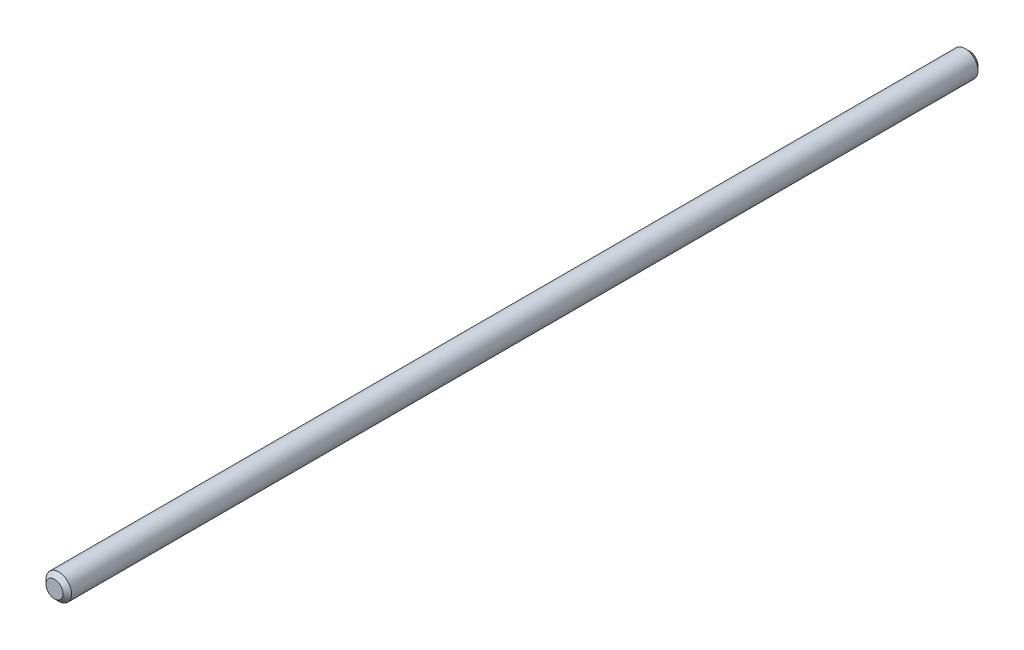
ISO-10303-21;
HEADER;
FILE_DESCRIPTION(('STEP AP214'),'2;1');
FILE_NAME('part.step','',(''),(''),'','','');
FILE_SCHEMA(('AUTOMOTIVE_DESIGN { 1 0 10303 214 1 1 1 1 }'));
ENDSEC;
DATA;
#1=APPLICATION_CONTEXT('core data for automotive mechanical design processes');
#2=APPLICATION_PROTOCOL_DEFINITION('international standard','automotive_design',2000,#1);
#3=PRODUCT_CONTEXT('',#1,'mechanical');
#4=PRODUCT('Part','Part','',(#3));
#5=PRODUCT_RELATED_PRODUCT_CATEGORY('part','',(#4));
#6=PRODUCT_DEFINITION_FORMATION('','',#4);
#7=PRODUCT_DEFINITION_CONTEXT('part definition',#1,'design');
#8=PRODUCT_DEFINITION('design','',#6,#7);
#9=PRODUCT_DEFINITION_SHAPE('','',#8);
#10=(LENGTH_UNIT() NAMED_UNIT(*) SI_UNIT(.MILLI.,.METRE.));
#11=(NAMED_UNIT(*) PLANE_ANGLE_UNIT() SI_UNIT($,.RADIAN.));
#12=(NAMED_UNIT(*) SI_UNIT($,.STERADIAN.) SOLID_ANGLE_UNIT());
#13=UNCERTAINTY_MEASURE_WITH_UNIT(LENGTH_MEASURE(1.E-05),#10,'distance_accuracy_value','');
#14=(GEOMETRIC_REPRESENTATION_CONTEXT(3) GLOBAL_UNCERTAINTY_ASSIGNED_CONTEXT((#13)) GLOBAL_UNIT_ASSIGNED_CONTEXT((#10,
#11,#12)) REPRESENTATION_CONTEXT('',''));
#15=CARTESIAN_POINT('',(0.,0.,0.));
#16=DIRECTION('',(0.,0.,1.));
#17=DIRECTION('',(1.,0.,0.));
#18=AXIS2_PLACEMENT_3D('',#15,#16,#17);
#19=CARTESIAN_POINT('',(0.,0.,107.5));
#20=DIRECTION('',(0.,0.,-1.));
#21=DIRECTION('',(-1.,0.,0.));
#22=AXIS2_PLACEMENT_3D('',#19,#20,#21);
#23=CYLINDRICAL_SURFACE('',#22,3.);
#24=CARTESIAN_POINT('',(0.,0.,-106.5));
#25=DIRECTION('',(0.,0.,1.));
#26=DIRECTION('',(1.,0.,0.));
#27=AXIS2_PLACEMENT_3D('',#24,#25,#26);
#28=CIRCLE('',#27,3.);
#29=CARTESIAN_POINT('',(3.,0.,-106.5));
#30=VERTEX_POINT('',#29);
#31=EDGE_CURVE('E41',#30,#30,#28,.T.);
#32=ORIENTED_EDGE('',*,*,#31,.T.);
#33=EDGE_LOOP('',(#32));
#34=FACE_BOUND('',#33,.T.);
#35=CARTESIAN_POINT('',(0.,0.,106.5));
#36=DIRECTION('',(0.,0.,1.));
#37=DIRECTION('',(1.,0.,0.));
#38=AXIS2_PLACEMENT_3D('',#35,#36,#37);
#39=CIRCLE('',#38,3.);
#40=CARTESIAN_POINT('',(3.,0.,106.5));
#41=VERTEX_POINT('',#40);
#42=EDGE_CURVE('E45',#41,#41,#39,.F.);
#43=ORIENTED_EDGE('',*,*,#42,.T.);
#44=EDGE_LOOP('',(#43));
#45=FACE_BOUND('',#44,.T.);
#46=ADVANCED_FACE('F30',(#34,#45),#23,.T.);
#47=CARTESIAN_POINT('',(0.,0.,107.5));
#48=DIRECTION('',(0.,0.,1.));
#49=DIRECTION('',(1.,0.,0.));
#50=AXIS2_PLACEMENT_3D('',#47,#48,#49);
#51=PLANE('',#50);
#52=CARTESIAN_POINT('',(0.,0.,107.5));
#53=DIRECTION('',(0.,0.,1.));
#54=DIRECTION('',(1.,0.,0.));
#55=AXIS2_PLACEMENT_3D('',#52,#53,#54);
#56=CIRCLE('',#55,2.00000000000003);
#57=CARTESIAN_POINT('',(2.00000000000003,0.,107.5));
#58=VERTEX_POINT('',#57);
#59=EDGE_CURVE('E10',#58,#58,#56,.T.);
#60=ORIENTED_EDGE('',*,*,#59,.T.);
#61=EDGE_LOOP('',(#60));
#62=FACE_BOUND('',#61,.T.);
#63=ADVANCED_FACE('F61',(#62),#51,.T.);
#64=CARTESIAN_POINT('',(0.,0.,-107.5));
#65=DIRECTION('',(0.,0.,1.));
#66=DIRECTION('',(1.,0.,0.));
#67=AXIS2_PLACEMENT_3D('',#64,#65,#66);
#68=PLANE('',#67);
#69=CARTESIAN_POINT('',(0.,0.,-107.5));
#70=DIRECTION('',(0.,0.,1.));
#71=DIRECTION('',(1.,0.,0.));
#72=AXIS2_PLACEMENT_3D('',#69,#70,#71);
#73=CIRCLE('',#72,2.00000000000003);
#74=CARTESIAN_POINT('',(2.00000000000003,0.,-107.5));
#75=VERTEX_POINT('',#74);
#76=EDGE_CURVE('E37',#75,#75,#73,.F.);
#77=ORIENTED_EDGE('',*,*,#76,.T.);
#78=EDGE_LOOP('',(#77));
#79=FACE_BOUND('',#78,.T.);
#80=ADVANCED_FACE('F58',(#79),#68,.F.);
#81=CARTESIAN_POINT('',(0.,0.,-106.5));
#82=DIRECTION('',(0.,0.,1.));
#83=DIRECTION('',(1.,0.,0.));
#84=AXIS2_PLACEMENT_3D('',#81,#82,#83);
#85=CONICAL_SURFACE('',#84,3.,0.785398163397447);
#86=ORIENTED_EDGE('',*,*,#76,.F.);
#87=EDGE_LOOP('',(#86));
#88=FACE_BOUND('',#87,.T.);
#89=ORIENTED_EDGE('',*,*,#31,.F.);
#90=EDGE_LOOP('',(#89));
#91=FACE_BOUND('',#90,.T.);
#92=ADVANCED_FACE('F54',(#88,#91),#85,.T.);
#93=CARTESIAN_POINT('',(0.,0.,107.5));
#94=DIRECTION('',(0.,0.,-1.));
#95=DIRECTION('',(-1.,0.,0.));
#96=AXIS2_PLACEMENT_3D('',#93,#94,#95);
#97=CONICAL_SURFACE('',#96,2.00000000000003,0.78539816339744);
#98=ORIENTED_EDGE('',*,*,#42,.F.);
#99=EDGE_LOOP('',(#98));
#100=FACE_BOUND('',#99,.T.);
#101=ORIENTED_EDGE('',*,*,#59,.F.);
#102=EDGE_LOOP('',(#101));
#103=FACE_BOUND('',#102,.T.);
#104=ADVANCED_FACE('F32',(#100,#103),#97,.T.);
#105=CLOSED_SHELL('',(#46,#63,#80,#92,#104));
#106=MANIFOLD_SOLID_BREP('B2',#105);
#107=ADVANCED_BREP_SHAPE_REPRESENTATION('',(#18,#106),#14);
#108=SHAPE_DEFINITION_REPRESENTATION(#9,#107);
ENDSEC;
END-ISO-10303-21;
